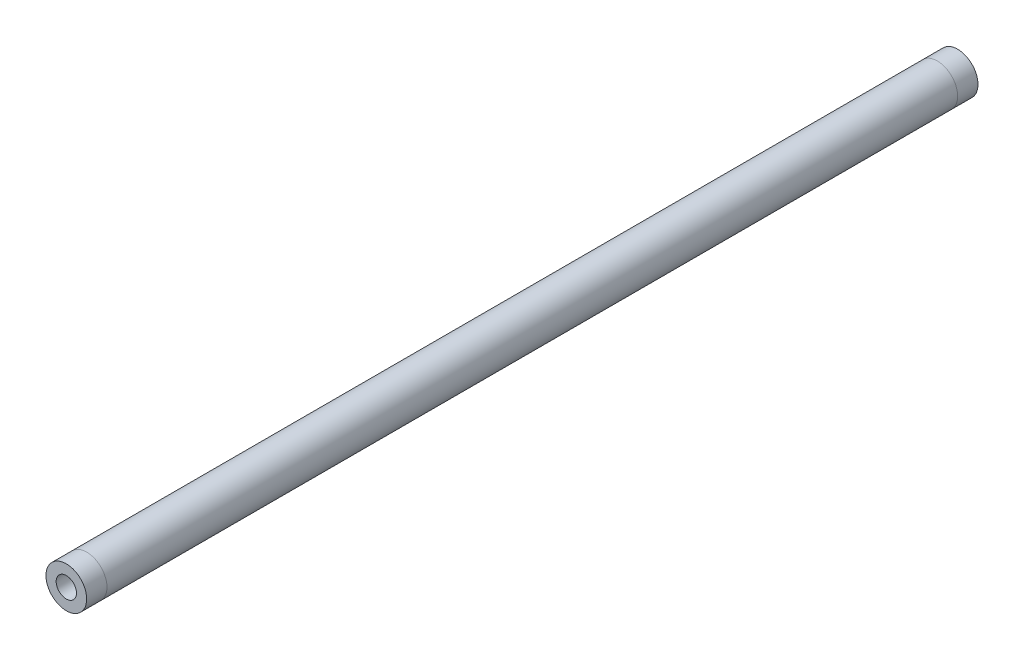
ISO-10303-21;
HEADER;
FILE_DESCRIPTION(('STEP AP214'),'2;1');
FILE_NAME('part.step','',(''),(''),'','','');
FILE_SCHEMA(('AUTOMOTIVE_DESIGN { 1 0 10303 214 1 1 1 1 }'));
ENDSEC;
DATA;
#1=APPLICATION_CONTEXT('core data for automotive mechanical design processes');
#2=APPLICATION_PROTOCOL_DEFINITION('international standard','automotive_design',2000,#1);
#3=PRODUCT_CONTEXT('',#1,'mechanical');
#4=PRODUCT('Part','Part','',(#3));
#5=PRODUCT_RELATED_PRODUCT_CATEGORY('part','',(#4));
#6=PRODUCT_DEFINITION_FORMATION('','',#4);
#7=PRODUCT_DEFINITION_CONTEXT('part definition',#1,'design');
#8=PRODUCT_DEFINITION('design','',#6,#7);
#9=PRODUCT_DEFINITION_SHAPE('','',#8);
#10=(LENGTH_UNIT() NAMED_UNIT(*) SI_UNIT(.MILLI.,.METRE.));
#11=(NAMED_UNIT(*) PLANE_ANGLE_UNIT() SI_UNIT($,.RADIAN.));
#12=(NAMED_UNIT(*) SI_UNIT($,.STERADIAN.) SOLID_ANGLE_UNIT());
#13=UNCERTAINTY_MEASURE_WITH_UNIT(LENGTH_MEASURE(1.E-05),#10,'distance_accuracy_value','');
#14=(GEOMETRIC_REPRESENTATION_CONTEXT(3) GLOBAL_UNCERTAINTY_ASSIGNED_CONTEXT((#13)) GLOBAL_UNIT_ASSIGNED_CONTEXT((#10,
#11,#12)) REPRESENTATION_CONTEXT('',''));
#15=CARTESIAN_POINT('',(0.,0.,0.));
#16=DIRECTION('',(0.,0.,1.));
#17=DIRECTION('',(1.,0.,0.));
#18=AXIS2_PLACEMENT_3D('',#15,#16,#17);
#19=CARTESIAN_POINT('',(0.,0.,-311.692360642138));
#20=DIRECTION('',(0.,0.,1.));
#21=DIRECTION('',(1.,0.,0.));
#22=AXIS2_PLACEMENT_3D('',#19,#20,#21);
#23=CYLINDRICAL_SURFACE('',#22,6.35);
#24=CARTESIAN_POINT('',(0.,0.,-293.7318484));
#25=DIRECTION('',(0.,0.,1.));
#26=DIRECTION('',(1.,0.,0.));
#27=AXIS2_PLACEMENT_3D('',#24,#25,#26);
#28=CIRCLE('',#27,6.35);
#29=CARTESIAN_POINT('',(6.35,0.,-293.7318484));
#30=VERTEX_POINT('',#29);
#31=EDGE_CURVE('E12',#30,#30,#28,.F.);
#32=ORIENTED_EDGE('',*,*,#31,.F.);
#33=EDGE_LOOP('',(#32));
#34=FACE_BOUND('',#33,.T.);
#35=CARTESIAN_POINT('',(0.,0.,-28.2575));
#36=DIRECTION('',(0.,0.,1.));
#37=DIRECTION('',(1.,0.,0.));
#38=AXIS2_PLACEMENT_3D('',#35,#36,#37);
#39=CIRCLE('',#38,6.35);
#40=CARTESIAN_POINT('',(6.35,0.,-28.2575));
#41=VERTEX_POINT('',#40);
#42=EDGE_CURVE('E79',#41,#41,#39,.T.);
#43=ORIENTED_EDGE('',*,*,#42,.F.);
#44=EDGE_LOOP('',(#43));
#45=FACE_BOUND('',#44,.T.);
#46=ADVANCED_FACE('F68',(#34,#45),#23,.T.);
#47=CARTESIAN_POINT('',(0.,0.,-28.2575));
#48=DIRECTION('',(0.,0.,1.));
#49=DIRECTION('',(1.,0.,0.));
#50=AXIS2_PLACEMENT_3D('',#47,#48,#49);
#51=PLANE('',#50);
#52=CARTESIAN_POINT('',(0.,0.,-28.2575));
#53=DIRECTION('',(0.,0.,1.));
#54=DIRECTION('',(1.,0.,0.));
#55=AXIS2_PLACEMENT_3D('',#52,#53,#54);
#56=CIRCLE('',#55,4.7625);
#57=CARTESIAN_POINT('',(4.7625,0.,-28.2575));
#58=VERTEX_POINT('',#57);
#59=EDGE_CURVE('E81',#58,#58,#56,.T.);
#60=ORIENTED_EDGE('',*,*,#59,.F.);
#61=EDGE_LOOP('',(#60));
#62=FACE_BOUND('',#61,.T.);
#63=ORIENTED_EDGE('',*,*,#42,.T.);
#64=EDGE_LOOP('',(#63));
#65=FACE_BOUND('',#64,.T.);
#66=ADVANCED_FACE('F86',(#62,#65),#51,.T.);
#67=CARTESIAN_POINT('',(0.,0.,-311.692360642138));
#68=DIRECTION('',(0.,0.,1.));
#69=DIRECTION('',(1.,0.,0.));
#70=AXIS2_PLACEMENT_3D('',#67,#68,#69);
#71=CYLINDRICAL_SURFACE('',#70,4.7625);
#72=CARTESIAN_POINT('',(0.,0.,-293.7318484));
#73=DIRECTION('',(0.,0.,1.));
#74=DIRECTION('',(1.,0.,0.));
#75=AXIS2_PLACEMENT_3D('',#72,#73,#74);
#76=CIRCLE('',#75,4.7625);
#77=CARTESIAN_POINT('',(4.7625,0.,-293.7318484));
#78=VERTEX_POINT('',#77);
#79=EDGE_CURVE('E71',#78,#78,#76,.F.);
#80=ORIENTED_EDGE('',*,*,#79,.T.);
#81=EDGE_LOOP('',(#80));
#82=FACE_BOUND('',#81,.T.);
#83=ORIENTED_EDGE('',*,*,#59,.T.);
#84=EDGE_LOOP('',(#83));
#85=FACE_BOUND('',#84,.T.);
#86=ADVANCED_FACE('F93',(#82,#85),#71,.F.);
#87=CARTESIAN_POINT('',(0.,0.,-293.7318484));
#88=DIRECTION('',(0.,0.,1.));
#89=DIRECTION('',(1.,0.,0.));
#90=AXIS2_PLACEMENT_3D('',#87,#88,#89);
#91=PLANE('',#90);
#92=ORIENTED_EDGE('',*,*,#31,.T.);
#93=EDGE_LOOP('',(#92));
#94=FACE_BOUND('',#93,.T.);
#95=ORIENTED_EDGE('',*,*,#79,.F.);
#96=EDGE_LOOP('',(#95));
#97=FACE_BOUND('',#96,.T.);
#98=ADVANCED_FACE('F98',(#94,#97),#91,.F.);
#99=CLOSED_SHELL('',(#46,#66,#86,#98));
#100=MANIFOLD_SOLID_BREP('B2',#99);
#101=CARTESIAN_POINT('',(0.,0.,-293.7318484));
#102=DIRECTION('',(0.,0.,1.));
#103=DIRECTION('',(1.,0.,0.));
#104=AXIS2_PLACEMENT_3D('',#101,#102,#103);
#105=PLANE('',#104);
#106=CARTESIAN_POINT('',(0.,0.,-293.7318484));
#107=DIRECTION('',(0.,0.,1.));
#108=DIRECTION('',(1.,0.,0.));
#109=AXIS2_PLACEMENT_3D('',#106,#107,#108);
#110=CIRCLE('',#109,6.35);
#111=CARTESIAN_POINT('',(6.35,0.,-293.7318484));
#112=VERTEX_POINT('',#111);
#113=EDGE_CURVE('E67',#112,#112,#110,.T.);
#114=ORIENTED_EDGE('',*,*,#113,.T.);
#115=EDGE_LOOP('',(#114));
#116=FACE_BOUND('',#115,.T.);
#117=CARTESIAN_POINT('',(0.,0.,-293.7318484));
#118=DIRECTION('',(0.,0.,1.));
#119=DIRECTION('',(1.,0.,0.));
#120=AXIS2_PLACEMENT_3D('',#117,#118,#119);
#121=CIRCLE('',#120,4.7625);
#122=CARTESIAN_POINT('',(-4.7625,0.,-293.7318484));
#123=VERTEX_POINT('',#122);
#124=EDGE_CURVE('E151',#123,#123,#121,.T.);
#125=ORIENTED_EDGE('',*,*,#124,.F.);
#126=EDGE_LOOP('',(#125));
#127=FACE_BOUND('',#126,.T.);
#128=ADVANCED_FACE('F137',(#116,#127),#105,.T.);
#129=CARTESIAN_POINT('',(0.,0.,-293.7318484));
#130=DIRECTION('',(0.,0.,-1.));
#131=DIRECTION('',(-1.,0.,0.));
#132=AXIS2_PLACEMENT_3D('',#129,#130,#131);
#133=CYLINDRICAL_SURFACE('',#132,6.35);
#134=ORIENTED_EDGE('',*,*,#113,.F.);
#135=EDGE_LOOP('',(#134));
#136=FACE_BOUND('',#135,.T.);
#137=CARTESIAN_POINT('',(0.,0.,-300.0818484));
#138=DIRECTION('',(0.,0.,1.));
#139=DIRECTION('',(1.,0.,0.));
#140=AXIS2_PLACEMENT_3D('',#137,#138,#139);
#141=CIRCLE('',#140,6.35);
#142=CARTESIAN_POINT('',(6.35,0.,-300.0818484));
#143=VERTEX_POINT('',#142);
#144=EDGE_CURVE('E149',#143,#143,#141,.T.);
#145=ORIENTED_EDGE('',*,*,#144,.T.);
#146=EDGE_LOOP('',(#145));
#147=FACE_BOUND('',#146,.T.);
#148=ADVANCED_FACE('F139',(#136,#147),#133,.T.);
#149=CARTESIAN_POINT('',(0.,0.,-293.7318484));
#150=DIRECTION('',(0.,0.,-1.));
#151=DIRECTION('',(-1.,0.,0.));
#152=AXIS2_PLACEMENT_3D('',#149,#150,#151);
#153=CYLINDRICAL_SURFACE('',#152,3.175);
#154=CARTESIAN_POINT('',(0.,0.,-300.0818484));
#155=DIRECTION('',(0.,0.,1.));
#156=DIRECTION('',(1.,0.,0.));
#157=AXIS2_PLACEMENT_3D('',#154,#155,#156);
#158=CIRCLE('',#157,3.175);
#159=CARTESIAN_POINT('',(3.175,0.,-300.0818484));
#160=VERTEX_POINT('',#159);
#161=EDGE_CURVE('E141',#160,#160,#158,.T.);
#162=ORIENTED_EDGE('',*,*,#161,.F.);
#163=EDGE_LOOP('',(#162));
#164=FACE_BOUND('',#163,.T.);
#165=CARTESIAN_POINT('',(0.,0.,-284.2068484));
#166=DIRECTION('',(0.,0.,1.));
#167=DIRECTION('',(1.,0.,0.));
#168=AXIS2_PLACEMENT_3D('',#165,#166,#167);
#169=CIRCLE('',#168,3.175);
#170=CARTESIAN_POINT('',(3.175,0.,-284.2068484));
#171=VERTEX_POINT('',#170);
#172=EDGE_CURVE('E161',#171,#171,#169,.T.);
#173=ORIENTED_EDGE('',*,*,#172,.T.);
#174=EDGE_LOOP('',(#173));
#175=FACE_BOUND('',#174,.T.);
#176=ADVANCED_FACE('F166',(#164,#175),#153,.F.);
#177=CARTESIAN_POINT('',(0.,0.,-300.0818484));
#178=DIRECTION('',(0.,0.,1.));
#179=DIRECTION('',(1.,0.,0.));
#180=AXIS2_PLACEMENT_3D('',#177,#178,#179);
#181=PLANE('',#180);
#182=ORIENTED_EDGE('',*,*,#144,.F.);
#183=EDGE_LOOP('',(#182));
#184=FACE_BOUND('',#183,.T.);
#185=ORIENTED_EDGE('',*,*,#161,.T.);
#186=EDGE_LOOP('',(#185));
#187=FACE_BOUND('',#186,.T.);
#188=ADVANCED_FACE('F171',(#184,#187),#181,.F.);
#189=CARTESIAN_POINT('',(0.,0.,-284.2068484));
#190=DIRECTION('',(0.,0.,1.));
#191=DIRECTION('',(1.,0.,0.));
#192=AXIS2_PLACEMENT_3D('',#189,#190,#191);
#193=PLANE('',#192);
#194=CARTESIAN_POINT('',(0.,0.,-284.2068484));
#195=DIRECTION('',(0.,0.,1.));
#196=DIRECTION('',(1.,0.,0.));
#197=AXIS2_PLACEMENT_3D('',#194,#195,#196);
#198=CIRCLE('',#197,4.7625);
#199=CARTESIAN_POINT('',(-4.7625,0.,-284.2068484));
#200=VERTEX_POINT('',#199);
#201=EDGE_CURVE('E154',#200,#200,#198,.T.);
#202=ORIENTED_EDGE('',*,*,#201,.T.);
#203=EDGE_LOOP('',(#202));
#204=FACE_BOUND('',#203,.T.);
#205=ORIENTED_EDGE('',*,*,#172,.F.);
#206=EDGE_LOOP('',(#205));
#207=FACE_BOUND('',#206,.T.);
#208=ADVANCED_FACE('F168',(#204,#207),#193,.T.);
#209=CARTESIAN_POINT('',(0.,0.,-284.2068484));
#210=DIRECTION('',(0.,0.,-1.));
#211=DIRECTION('',(-1.,0.,0.));
#212=AXIS2_PLACEMENT_3D('',#209,#210,#211);
#213=CYLINDRICAL_SURFACE('',#212,4.7625);
#214=CARTESIAN_POINT('',(-4.7625,0.,-284.2068484));
#215=CARTESIAN_POINT('',(-4.7625,0.,-284.30606715));
#216=CARTESIAN_POINT('',(-4.7625,0.,-284.4052859));
#217=CARTESIAN_POINT('',(-4.7625,0.,-284.6037234));
#218=CARTESIAN_POINT('',(-4.7625,0.,-284.70294215));
#219=CARTESIAN_POINT('',(-4.7625,0.,-284.90137965));
#220=CARTESIAN_POINT('',(-4.7625,0.,-285.0005984));
#221=CARTESIAN_POINT('',(-4.7625,0.,-285.1990359));
#222=CARTESIAN_POINT('',(-4.7625,0.,-285.29825465));
#223=CARTESIAN_POINT('',(-4.7625,0.,-285.49669215));
#224=CARTESIAN_POINT('',(-4.7625,0.,-285.5959109));
#225=CARTESIAN_POINT('',(-4.7625,0.,-285.7943484));
#226=CARTESIAN_POINT('',(-4.7625,0.,-285.89356715));
#227=CARTESIAN_POINT('',(-4.7625,0.,-286.09200465));
#228=CARTESIAN_POINT('',(-4.7625,0.,-286.1912234));
#229=CARTESIAN_POINT('',(-4.7625,0.,-286.3896609));
#230=CARTESIAN_POINT('',(-4.7625,0.,-286.48887965));
#231=CARTESIAN_POINT('',(-4.7625,0.,-286.68731715));
#232=CARTESIAN_POINT('',(-4.7625,0.,-286.7865359));
#233=CARTESIAN_POINT('',(-4.7625,0.,-286.9849734));
#234=CARTESIAN_POINT('',(-4.7625,0.,-287.08419215));
#235=CARTESIAN_POINT('',(-4.7625,0.,-287.28262965));
#236=CARTESIAN_POINT('',(-4.7625,0.,-287.3818484));
#237=CARTESIAN_POINT('',(-4.7625,0.,-287.5802859));
#238=CARTESIAN_POINT('',(-4.7625,0.,-287.67950465));
#239=CARTESIAN_POINT('',(-4.7625,0.,-287.87794215));
#240=CARTESIAN_POINT('',(-4.7625,0.,-287.9771609));
#241=CARTESIAN_POINT('',(-4.7625,0.,-288.1755984));
#242=CARTESIAN_POINT('',(-4.7625,0.,-288.27481715));
#243=CARTESIAN_POINT('',(-4.7625,0.,-288.47325465));
#244=CARTESIAN_POINT('',(-4.7625,0.,-288.5724734));
#245=CARTESIAN_POINT('',(-4.7625,0.,-288.7709109));
#246=CARTESIAN_POINT('',(-4.7625,0.,-288.87012965));
#247=CARTESIAN_POINT('',(-4.7625,0.,-289.06856715));
#248=CARTESIAN_POINT('',(-4.7625,0.,-289.1677859));
#249=CARTESIAN_POINT('',(-4.7625,0.,-289.3662234));
#250=CARTESIAN_POINT('',(-4.7625,0.,-289.46544215));
#251=CARTESIAN_POINT('',(-4.7625,0.,-289.66387965));
#252=CARTESIAN_POINT('',(-4.7625,0.,-289.7630984));
#253=CARTESIAN_POINT('',(-4.7625,0.,-289.9615359));
#254=CARTESIAN_POINT('',(-4.7625,0.,-290.06075465));
#255=CARTESIAN_POINT('',(-4.7625,0.,-290.25919215));
#256=CARTESIAN_POINT('',(-4.7625,0.,-290.3584109));
#257=CARTESIAN_POINT('',(-4.7625,0.,-290.5568484));
#258=CARTESIAN_POINT('',(-4.7625,0.,-290.65606715));
#259=CARTESIAN_POINT('',(-4.7625,0.,-290.85450465));
#260=CARTESIAN_POINT('',(-4.7625,0.,-290.9537234));
#261=CARTESIAN_POINT('',(-4.7625,0.,-291.1521609));
#262=CARTESIAN_POINT('',(-4.7625,0.,-291.25137965));
#263=CARTESIAN_POINT('',(-4.7625,0.,-291.44981715));
#264=CARTESIAN_POINT('',(-4.7625,0.,-291.5490359));
#265=CARTESIAN_POINT('',(-4.7625,0.,-291.7474734));
#266=CARTESIAN_POINT('',(-4.7625,0.,-291.84669215));
#267=CARTESIAN_POINT('',(-4.7625,0.,-292.04512965));
#268=CARTESIAN_POINT('',(-4.7625,0.,-292.1443484));
#269=CARTESIAN_POINT('',(-4.7625,0.,-292.3427859));
#270=CARTESIAN_POINT('',(-4.7625,0.,-292.44200465));
#271=CARTESIAN_POINT('',(-4.7625,0.,-292.64044215));
#272=CARTESIAN_POINT('',(-4.7625,0.,-292.7396609));
#273=CARTESIAN_POINT('',(-4.7625,0.,-292.9380984));
#274=CARTESIAN_POINT('',(-4.7625,0.,-293.03731715));
#275=CARTESIAN_POINT('',(-4.7625,0.,-293.23575465));
#276=CARTESIAN_POINT('',(-4.7625,0.,-293.3349734));
#277=CARTESIAN_POINT('',(-4.7625,0.,-293.5334109));
#278=CARTESIAN_POINT('',(-4.7625,0.,-293.63262965));
#279=CARTESIAN_POINT('',(-4.7625,0.,-293.7318484));
#280=B_SPLINE_CURVE_WITH_KNOTS('',3,(#214,#215,#216,#217,#218,#219,#220,#221,#222,#223,#224,
#225,#226,#227,#228,#229,#230,#231,#232,#233,#234,#235,#236,#237,#238,#239,#240,#241,#242,#243,
#244,#245,#246,#247,#248,#249,#250,#251,#252,#253,#254,#255,#256,#257,#258,#259,#260,#261,#262,
#263,#264,#265,#266,#267,#268,#269,#270,#271,#272,#273,#274,#275,#276,#277,#278,#279),
.UNSPECIFIED.,.F.,.F.,(4,2,2,2,2,2,2,2,2,2,2,2,2,2,2,2,2,2,2,2,2,2,2,2,2,2,2,2,2,2,2,2,4),(0.,
0.297656249999945,0.595312499999945,0.892968749999945,1.19062499999995,1.48828124999995,
1.78593749999995,2.08359374999995,2.38124999999995,2.67890624999995,2.97656249999995,
3.27421874999995,3.57187499999995,3.86953124999995,4.16718749999995,4.46484374999995,
4.76249999999995,5.06015624999995,5.35781249999995,5.65546874999995,5.95312499999995,
6.25078124999995,6.54843749999995,6.84609374999995,7.14374999999995,7.44140624999995,
7.73906249999995,8.03671874999995,8.33437499999995,8.63203124999995,8.92968749999995,
9.22734374999995,9.52499999999995),.UNSPECIFIED.);
#281=EDGE_CURVE('BSEAM170',#200,#123,#280,.T.);
#282=ORIENTED_EDGE('',*,*,#201,.F.);
#283=ORIENTED_EDGE('',*,*,#124,.T.);
#284=ORIENTED_EDGE('',*,*,#281,.T.);
#285=ORIENTED_EDGE('',*,*,#281,.F.);
#286=EDGE_LOOP('',(#282,#284,#283,#285));
#287=FACE_BOUND('',#286,.T.);
#288=ADVANCED_FACE('F170',(#287),#213,.T.);
#289=CLOSED_SHELL('',(#128,#148,#176,#188,#208,#288));
#290=MANIFOLD_SOLID_BREP('B7',#289);
#291=CARTESIAN_POINT('',(0.,0.,-28.2575));
#292=DIRECTION('',(0.,0.,1.));
#293=DIRECTION('',(1.,0.,0.));
#294=AXIS2_PLACEMENT_3D('',#291,#292,#293);
#295=CYLINDRICAL_SURFACE('',#294,6.35);
#296=CARTESIAN_POINT('',(0.,0.,-28.2575));
#297=DIRECTION('',(0.,0.,1.));
#298=DIRECTION('',(1.,0.,0.));
#299=AXIS2_PLACEMENT_3D('',#296,#297,#298);
#300=CIRCLE('',#299,6.35);
#301=CARTESIAN_POINT('',(6.35,0.,-28.2575));
#302=VERTEX_POINT('',#301);
#303=EDGE_CURVE('E136',#302,#302,#300,.T.);
#304=ORIENTED_EDGE('',*,*,#303,.T.);
#305=EDGE_LOOP('',(#304));
#306=FACE_BOUND('',#305,.T.);
#307=CARTESIAN_POINT('',(0.,0.,-21.9075));
#308=DIRECTION('',(0.,0.,1.));
#309=DIRECTION('',(1.,0.,0.));
#310=AXIS2_PLACEMENT_3D('',#307,#308,#309);
#311=CIRCLE('',#310,6.35);
#312=CARTESIAN_POINT('',(6.35,0.,-21.9075));
#313=VERTEX_POINT('',#312);
#314=EDGE_CURVE('E249',#313,#313,#311,.T.);
#315=ORIENTED_EDGE('',*,*,#314,.F.);
#316=EDGE_LOOP('',(#315));
#317=FACE_BOUND('',#316,.T.);
#318=ADVANCED_FACE('F238',(#306,#317),#295,.T.);
#319=CARTESIAN_POINT('',(0.,0.,-28.2575));
#320=DIRECTION('',(0.,0.,1.));
#321=DIRECTION('',(1.,0.,0.));
#322=AXIS2_PLACEMENT_3D('',#319,#320,#321);
#323=CYLINDRICAL_SURFACE('',#322,3.175);
#324=CARTESIAN_POINT('',(0.,0.,-21.9075));
#325=DIRECTION('',(0.,0.,1.));
#326=DIRECTION('',(1.,0.,0.));
#327=AXIS2_PLACEMENT_3D('',#324,#325,#326);
#328=CIRCLE('',#327,3.175);
#329=CARTESIAN_POINT('',(3.175,0.,-21.9075));
#330=VERTEX_POINT('',#329);
#331=EDGE_CURVE('E241',#330,#330,#328,.T.);
#332=ORIENTED_EDGE('',*,*,#331,.T.);
#333=EDGE_LOOP('',(#332));
#334=FACE_BOUND('',#333,.T.);
#335=CARTESIAN_POINT('',(0.,0.,-37.7825));
#336=DIRECTION('',(0.,0.,1.));
#337=DIRECTION('',(1.,0.,0.));
#338=AXIS2_PLACEMENT_3D('',#335,#336,#337);
#339=CIRCLE('',#338,3.175);
#340=CARTESIAN_POINT('',(3.175,0.,-37.7825));
#341=VERTEX_POINT('',#340);
#342=EDGE_CURVE('E261',#341,#341,#339,.T.);
#343=ORIENTED_EDGE('',*,*,#342,.F.);
#344=EDGE_LOOP('',(#343));
#345=FACE_BOUND('',#344,.T.);
#346=ADVANCED_FACE('F269',(#334,#345),#323,.F.);
#347=CARTESIAN_POINT('',(0.,0.,-28.2575));
#348=DIRECTION('',(0.,0.,1.));
#349=DIRECTION('',(1.,0.,0.));
#350=AXIS2_PLACEMENT_3D('',#347,#348,#349);
#351=PLANE('',#350);
#352=CARTESIAN_POINT('',(0.,0.,-28.2575));
#353=DIRECTION('',(0.,0.,1.));
#354=DIRECTION('',(1.,0.,0.));
#355=AXIS2_PLACEMENT_3D('',#352,#353,#354);
#356=CIRCLE('',#355,4.7625);
#357=CARTESIAN_POINT('',(4.7625,0.,-28.2575));
#358=VERTEX_POINT('',#357);
#359=EDGE_CURVE('E251',#358,#358,#356,.T.);
#360=ORIENTED_EDGE('',*,*,#359,.T.);
#361=EDGE_LOOP('',(#360));
#362=FACE_BOUND('',#361,.T.);
#363=ORIENTED_EDGE('',*,*,#303,.F.);
#364=EDGE_LOOP('',(#363));
#365=FACE_BOUND('',#364,.T.);
#366=ADVANCED_FACE('F271',(#362,#365),#351,.F.);
#367=CARTESIAN_POINT('',(0.,0.,-21.9075));
#368=DIRECTION('',(0.,0.,1.));
#369=DIRECTION('',(1.,0.,0.));
#370=AXIS2_PLACEMENT_3D('',#367,#368,#369);
#371=PLANE('',#370);
#372=ORIENTED_EDGE('',*,*,#314,.T.);
#373=EDGE_LOOP('',(#372));
#374=FACE_BOUND('',#373,.T.);
#375=ORIENTED_EDGE('',*,*,#331,.F.);
#376=EDGE_LOOP('',(#375));
#377=FACE_BOUND('',#376,.T.);
#378=ADVANCED_FACE('F277',(#374,#377),#371,.T.);
#379=CARTESIAN_POINT('',(0.,0.,-37.7825));
#380=DIRECTION('',(0.,0.,1.));
#381=DIRECTION('',(1.,0.,0.));
#382=AXIS2_PLACEMENT_3D('',#379,#380,#381);
#383=CYLINDRICAL_SURFACE('',#382,4.7625);
#384=CARTESIAN_POINT('',(0.,0.,-37.7825));
#385=DIRECTION('',(0.,0.,1.));
#386=DIRECTION('',(1.,0.,0.));
#387=AXIS2_PLACEMENT_3D('',#384,#385,#386);
#388=CIRCLE('',#387,4.7625);
#389=CARTESIAN_POINT('',(4.7625,0.,-37.7825));
#390=VERTEX_POINT('',#389);
#391=EDGE_CURVE('E254',#390,#390,#388,.T.);
#392=CARTESIAN_POINT('',(4.7625,0.,-37.7825));
#393=CARTESIAN_POINT('',(4.7625,0.,-37.68328125));
#394=CARTESIAN_POINT('',(4.7625,0.,-37.5840625));
#395=CARTESIAN_POINT('',(4.7625,0.,-37.385625));
#396=CARTESIAN_POINT('',(4.7625,0.,-37.28640625));
#397=CARTESIAN_POINT('',(4.7625,0.,-37.08796875));
#398=CARTESIAN_POINT('',(4.7625,0.,-36.98875));
#399=CARTESIAN_POINT('',(4.7625,0.,-36.7903125));
#400=CARTESIAN_POINT('',(4.7625,0.,-36.69109375));
#401=CARTESIAN_POINT('',(4.7625,0.,-36.49265625));
#402=CARTESIAN_POINT('',(4.7625,0.,-36.3934375));
#403=CARTESIAN_POINT('',(4.7625,0.,-36.195));
#404=CARTESIAN_POINT('',(4.7625,0.,-36.09578125));
#405=CARTESIAN_POINT('',(4.7625,0.,-35.89734375));
#406=CARTESIAN_POINT('',(4.7625,0.,-35.798125));
#407=CARTESIAN_POINT('',(4.7625,0.,-35.5996875));
#408=CARTESIAN_POINT('',(4.7625,0.,-35.50046875));
#409=CARTESIAN_POINT('',(4.7625,0.,-35.30203125));
#410=CARTESIAN_POINT('',(4.7625,0.,-35.2028125));
#411=CARTESIAN_POINT('',(4.7625,0.,-35.004375));
#412=CARTESIAN_POINT('',(4.7625,0.,-34.90515625));
#413=CARTESIAN_POINT('',(4.7625,0.,-34.70671875));
#414=CARTESIAN_POINT('',(4.7625,0.,-34.6075));
#415=CARTESIAN_POINT('',(4.7625,0.,-34.4090625));
#416=CARTESIAN_POINT('',(4.7625,0.,-34.30984375));
#417=CARTESIAN_POINT('',(4.7625,0.,-34.11140625));
#418=CARTESIAN_POINT('',(4.7625,0.,-34.0121875));
#419=CARTESIAN_POINT('',(4.7625,0.,-33.81375));
#420=CARTESIAN_POINT('',(4.7625,0.,-33.71453125));
#421=CARTESIAN_POINT('',(4.7625,0.,-33.51609375));
#422=CARTESIAN_POINT('',(4.7625,0.,-33.416875));
#423=CARTESIAN_POINT('',(4.7625,0.,-33.2184375));
#424=CARTESIAN_POINT('',(4.7625,0.,-33.11921875));
#425=CARTESIAN_POINT('',(4.7625,0.,-32.92078125));
#426=CARTESIAN_POINT('',(4.7625,0.,-32.8215625));
#427=CARTESIAN_POINT('',(4.7625,0.,-32.623125));
#428=CARTESIAN_POINT('',(4.7625,0.,-32.52390625));
#429=CARTESIAN_POINT('',(4.7625,0.,-32.32546875));
#430=CARTESIAN_POINT('',(4.7625,0.,-32.22625));
#431=CARTESIAN_POINT('',(4.7625,0.,-32.0278125));
#432=CARTESIAN_POINT('',(4.7625,0.,-31.92859375));
#433=CARTESIAN_POINT('',(4.7625,0.,-31.73015625));
#434=CARTESIAN_POINT('',(4.7625,0.,-31.6309375));
#435=CARTESIAN_POINT('',(4.7625,0.,-31.4325));
#436=CARTESIAN_POINT('',(4.7625,0.,-31.33328125));
#437=CARTESIAN_POINT('',(4.7625,0.,-31.13484375));
#438=CARTESIAN_POINT('',(4.7625,0.,-31.035625));
#439=CARTESIAN_POINT('',(4.7625,0.,-30.8371875));
#440=CARTESIAN_POINT('',(4.7625,0.,-30.73796875));
#441=CARTESIAN_POINT('',(4.7625,0.,-30.53953125));
#442=CARTESIAN_POINT('',(4.7625,0.,-30.4403125));
#443=CARTESIAN_POINT('',(4.7625,0.,-30.241875));
#444=CARTESIAN_POINT('',(4.7625,0.,-30.14265625));
#445=CARTESIAN_POINT('',(4.7625,0.,-29.94421875));
#446=CARTESIAN_POINT('',(4.7625,0.,-29.845));
#447=CARTESIAN_POINT('',(4.7625,0.,-29.6465625));
#448=CARTESIAN_POINT('',(4.7625,0.,-29.54734375));
#449=CARTESIAN_POINT('',(4.7625,0.,-29.34890625));
#450=CARTESIAN_POINT('',(4.7625,0.,-29.2496875));
#451=CARTESIAN_POINT('',(4.7625,0.,-29.05125));
#452=CARTESIAN_POINT('',(4.7625,0.,-28.95203125));
#453=CARTESIAN_POINT('',(4.7625,0.,-28.75359375));
#454=CARTESIAN_POINT('',(4.7625,0.,-28.654375));
#455=CARTESIAN_POINT('',(4.7625,0.,-28.4559375));
#456=CARTESIAN_POINT('',(4.7625,0.,-28.35671875));
#457=CARTESIAN_POINT('',(4.7625,0.,-28.2575));
#458=B_SPLINE_CURVE_WITH_KNOTS('',3,(#392,#393,#394,#395,#396,#397,#398,#399,#400,#401,#402,
#403,#404,#405,#406,#407,#408,#409,#410,#411,#412,#413,#414,#415,#416,#417,#418,#419,#420,#421,
#422,#423,#424,#425,#426,#427,#428,#429,#430,#431,#432,#433,#434,#435,#436,#437,#438,#439,#440,
#441,#442,#443,#444,#445,#446,#447,#448,#449,#450,#451,#452,#453,#454,#455,#456,#457),
.UNSPECIFIED.,.F.,.F.,(4,2,2,2,2,2,2,2,2,2,2,2,2,2,2,2,2,2,2,2,2,2,2,2,2,2,2,2,2,2,2,2,4),(0.,
0.297656249999993,0.595312499999993,0.892968749999994,1.19062499999999,1.48828124999999,
1.78593749999999,2.08359374999999,2.38124999999999,2.67890624999999,2.97656249999999,
3.27421874999999,3.571875,3.86953125,4.1671875,4.46484375,4.7625,5.06015625,5.3578125,
5.65546875,5.953125,6.25078125,6.5484375,6.84609375,7.14375,7.44140625,7.7390625,8.03671875,
8.334375,8.63203125,8.9296875,9.22734375,9.525),.UNSPECIFIED.);
#459=EDGE_CURVE('BSEAM282',#390,#358,#458,.T.);
#460=ORIENTED_EDGE('',*,*,#391,.T.);
#461=ORIENTED_EDGE('',*,*,#359,.F.);
#462=ORIENTED_EDGE('',*,*,#459,.T.);
#463=ORIENTED_EDGE('',*,*,#459,.F.);
#464=EDGE_LOOP('',(#460,#462,#461,#463));
#465=FACE_BOUND('',#464,.T.);
#466=ADVANCED_FACE('F282',(#465),#383,.T.);
#467=CARTESIAN_POINT('',(0.,0.,-37.7825));
#468=DIRECTION('',(0.,0.,1.));
#469=DIRECTION('',(1.,0.,0.));
#470=AXIS2_PLACEMENT_3D('',#467,#468,#469);
#471=PLANE('',#470);
#472=ORIENTED_EDGE('',*,*,#342,.T.);
#473=EDGE_LOOP('',(#472));
#474=FACE_BOUND('',#473,.T.);
#475=ORIENTED_EDGE('',*,*,#391,.F.);
#476=EDGE_LOOP('',(#475));
#477=FACE_BOUND('',#476,.T.);
#478=ADVANCED_FACE('F266',(#474,#477),#471,.F.);
#479=CLOSED_SHELL('',(#318,#346,#366,#378,#466,#478));
#480=MANIFOLD_SOLID_BREP('B62',#479);
#481=ADVANCED_BREP_SHAPE_REPRESENTATION('',(#18,#100,#290,#480),#14);
#482=SHAPE_DEFINITION_REPRESENTATION(#9,#481);
ENDSEC;
END-ISO-10303-21;
